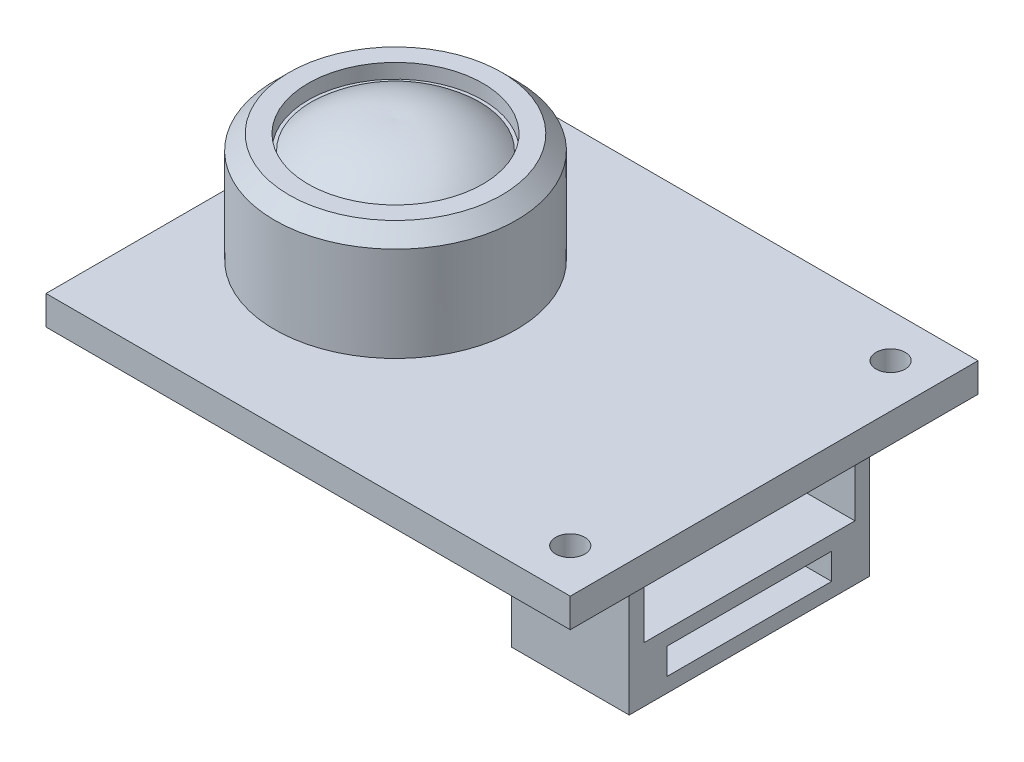
ISO-10303-21;
HEADER;
FILE_DESCRIPTION(('STEP AP214'),'2;1');
FILE_NAME('part.step','',(''),(''),'','','');
FILE_SCHEMA(('AUTOMOTIVE_DESIGN { 1 0 10303 214 1 1 1 1 }'));
ENDSEC;
DATA;
#1=APPLICATION_CONTEXT('core data for automotive mechanical design processes');
#2=APPLICATION_PROTOCOL_DEFINITION('international standard','automotive_design',2000,#1);
#3=PRODUCT_CONTEXT('',#1,'mechanical');
#4=PRODUCT('Part','Part','',(#3));
#5=PRODUCT_RELATED_PRODUCT_CATEGORY('part','',(#4));
#6=PRODUCT_DEFINITION_FORMATION('','',#4);
#7=PRODUCT_DEFINITION_CONTEXT('part definition',#1,'design');
#8=PRODUCT_DEFINITION('design','',#6,#7);
#9=PRODUCT_DEFINITION_SHAPE('','',#8);
#10=(LENGTH_UNIT() NAMED_UNIT(*) SI_UNIT(.MILLI.,.METRE.));
#11=(NAMED_UNIT(*) PLANE_ANGLE_UNIT() SI_UNIT($,.RADIAN.));
#12=(NAMED_UNIT(*) SI_UNIT($,.STERADIAN.) SOLID_ANGLE_UNIT());
#13=UNCERTAINTY_MEASURE_WITH_UNIT(LENGTH_MEASURE(1.E-05),#10,'distance_accuracy_value','');
#14=(GEOMETRIC_REPRESENTATION_CONTEXT(3) GLOBAL_UNCERTAINTY_ASSIGNED_CONTEXT((#13)) GLOBAL_UNIT_ASSIGNED_CONTEXT((#10,
#11,#12)) REPRESENTATION_CONTEXT('',''));
#15=CARTESIAN_POINT('',(0.,0.,0.));
#16=DIRECTION('',(0.,0.,1.));
#17=DIRECTION('',(1.,0.,0.));
#18=AXIS2_PLACEMENT_3D('',#15,#16,#17);
#19=CARTESIAN_POINT('',(0.,0.,0.));
#20=DIRECTION('',(0.,-1.,0.));
#21=DIRECTION('',(0.,0.,-1.));
#22=AXIS2_PLACEMENT_3D('',#19,#20,#21);
#23=PLANE('',#22);
#24=CARTESIAN_POINT('',(16.5,0.,-12.5));
#25=DIRECTION('',(0.,1.,0.));
#26=DIRECTION('',(0.,0.,1.));
#27=AXIS2_PLACEMENT_3D('',#24,#25,#26);
#28=CIRCLE('',#27,0.499999999999999);
#29=CARTESIAN_POINT('',(16.5,0.,-12.));
#30=VERTEX_POINT('',#29);
#31=EDGE_CURVE('E210',#30,#30,#28,.T.);
#32=ORIENTED_EDGE('',*,*,#31,.T.);
#33=EDGE_LOOP('',(#32));
#34=FACE_BOUND('',#33,.T.);
#35=DIRECTION('',(0.,0.,1.));
#36=VECTOR('',#35,1.);
#37=CARTESIAN_POINT('',(0.,0.,0.));
#38=LINE('',#37,#36);
#39=CARTESIAN_POINT('',(0.,0.,-14.));
#40=VERTEX_POINT('',#39);
#41=CARTESIAN_POINT('',(0.,0.,0.));
#42=VERTEX_POINT('',#41);
#43=EDGE_CURVE('E197',#40,#42,#38,.T.);
#44=ORIENTED_EDGE('',*,*,#43,.F.);
#45=DIRECTION('',(-1.,0.,0.));
#46=VECTOR('',#45,1.);
#47=CARTESIAN_POINT('',(0.,0.,-14.));
#48=LINE('',#47,#46);
#49=CARTESIAN_POINT('',(18.,0.,-14.));
#50=VERTEX_POINT('',#49);
#51=EDGE_CURVE('E217',#50,#40,#48,.T.);
#52=ORIENTED_EDGE('',*,*,#51,.F.);
#53=DIRECTION('',(0.,0.,-1.));
#54=VECTOR('',#53,1.);
#55=CARTESIAN_POINT('',(18.,0.,0.));
#56=LINE('',#55,#54);
#57=CARTESIAN_POINT('',(18.,0.,0.));
#58=VERTEX_POINT('',#57);
#59=EDGE_CURVE('E207',#58,#50,#56,.T.);
#60=ORIENTED_EDGE('',*,*,#59,.F.);
#61=DIRECTION('',(1.,0.,0.));
#62=VECTOR('',#61,1.);
#63=CARTESIAN_POINT('',(0.,0.,0.));
#64=LINE('',#63,#62);
#65=EDGE_CURVE('E204',#42,#58,#64,.T.);
#66=ORIENTED_EDGE('',*,*,#65,.F.);
#67=EDGE_LOOP('',(#44,#52,#60,#66));
#68=FACE_BOUND('',#67,.T.);
#69=CARTESIAN_POINT('',(16.5,0.,-1.5));
#70=DIRECTION('',(0.,1.,0.));
#71=DIRECTION('',(0.,0.,1.));
#72=AXIS2_PLACEMENT_3D('',#69,#70,#71);
#73=CIRCLE('',#72,0.499999999999999);
#74=CARTESIAN_POINT('',(16.5,0.,-1.));
#75=VERTEX_POINT('',#74);
#76=EDGE_CURVE('E344',#75,#75,#73,.T.);
#77=ORIENTED_EDGE('',*,*,#76,.T.);
#78=EDGE_LOOP('',(#77));
#79=FACE_BOUND('',#78,.T.);
#80=DIRECTION('',(-1.,0.,0.));
#81=VECTOR('',#80,1.);
#82=CARTESIAN_POINT('',(17.15,0.,-2.875));
#83=LINE('',#82,#81);
#84=CARTESIAN_POINT('',(17.15,0.,-2.875));
#85=VERTEX_POINT('',#84);
#86=CARTESIAN_POINT('',(13.1,0.,-2.875));
#87=VERTEX_POINT('',#86);
#88=EDGE_CURVE('E329',#85,#87,#83,.T.);
#89=ORIENTED_EDGE('',*,*,#88,.F.);
#90=DIRECTION('',(0.,0.,1.));
#91=VECTOR('',#90,1.);
#92=CARTESIAN_POINT('',(17.15,0.,-11.125));
#93=LINE('',#92,#91);
#94=CARTESIAN_POINT('',(17.15,0.,-11.125));
#95=VERTEX_POINT('',#94);
#96=EDGE_CURVE('E310',#95,#85,#93,.T.);
#97=ORIENTED_EDGE('',*,*,#96,.F.);
#98=DIRECTION('',(1.,0.,0.));
#99=VECTOR('',#98,1.);
#100=CARTESIAN_POINT('',(17.15,0.,-11.125));
#101=LINE('',#100,#99);
#102=CARTESIAN_POINT('',(13.1,0.,-11.125));
#103=VERTEX_POINT('',#102);
#104=EDGE_CURVE('E320',#103,#95,#101,.T.);
#105=ORIENTED_EDGE('',*,*,#104,.F.);
#106=DIRECTION('',(0.,0.,-1.));
#107=VECTOR('',#106,1.);
#108=CARTESIAN_POINT('',(13.1,0.,-11.125));
#109=LINE('',#108,#107);
#110=EDGE_CURVE('E331',#87,#103,#109,.T.);
#111=ORIENTED_EDGE('',*,*,#110,.F.);
#112=EDGE_LOOP('',(#89,#97,#105,#111));
#113=FACE_BOUND('',#112,.T.);
#114=ADVANCED_FACE('F38',(#34,#68,#79,#113),#23,.T.);
#115=CARTESIAN_POINT('',(0.,1.,0.));
#116=DIRECTION('',(0.,-1.,0.));
#117=DIRECTION('',(0.,0.,-1.));
#118=AXIS2_PLACEMENT_3D('',#115,#116,#117);
#119=PLANE('',#118);
#120=CARTESIAN_POINT('',(5.,1.,-7.));
#121=DIRECTION('',(0.,-1.,0.));
#122=DIRECTION('',(0.,0.,-1.));
#123=AXIS2_PLACEMENT_3D('',#120,#121,#122);
#124=CIRCLE('',#123,4.15);
#125=CARTESIAN_POINT('',(5.,1.,-11.15));
#126=VERTEX_POINT('',#125);
#127=EDGE_CURVE('E228',#126,#126,#124,.F.);
#128=ORIENTED_EDGE('',*,*,#127,.F.);
#129=EDGE_LOOP('',(#128));
#130=FACE_BOUND('',#129,.T.);
#131=DIRECTION('',(0.,0.,1.));
#132=VECTOR('',#131,1.);
#133=CARTESIAN_POINT('',(0.,1.,0.));
#134=LINE('',#133,#132);
#135=CARTESIAN_POINT('',(0.,1.,-14.));
#136=VERTEX_POINT('',#135);
#137=CARTESIAN_POINT('',(0.,1.,0.));
#138=VERTEX_POINT('',#137);
#139=EDGE_CURVE('E219',#136,#138,#134,.T.);
#140=ORIENTED_EDGE('',*,*,#139,.T.);
#141=DIRECTION('',(1.,0.,0.));
#142=VECTOR('',#141,1.);
#143=CARTESIAN_POINT('',(0.,1.,0.));
#144=LINE('',#143,#142);
#145=CARTESIAN_POINT('',(18.,1.,0.));
#146=VERTEX_POINT('',#145);
#147=EDGE_CURVE('E353',#138,#146,#144,.T.);
#148=ORIENTED_EDGE('',*,*,#147,.T.);
#149=DIRECTION('',(0.,0.,-1.));
#150=VECTOR('',#149,1.);
#151=CARTESIAN_POINT('',(18.,1.,0.));
#152=LINE('',#151,#150);
#153=CARTESIAN_POINT('',(18.,1.,-14.));
#154=VERTEX_POINT('',#153);
#155=EDGE_CURVE('E354',#146,#154,#152,.T.);
#156=ORIENTED_EDGE('',*,*,#155,.T.);
#157=DIRECTION('',(-1.,0.,0.));
#158=VECTOR('',#157,1.);
#159=CARTESIAN_POINT('',(0.,1.,-14.));
#160=LINE('',#159,#158);
#161=EDGE_CURVE('E213',#154,#136,#160,.T.);
#162=ORIENTED_EDGE('',*,*,#161,.T.);
#163=EDGE_LOOP('',(#140,#148,#156,#162));
#164=FACE_BOUND('',#163,.T.);
#165=CARTESIAN_POINT('',(16.5,1.,-12.5));
#166=DIRECTION('',(0.,1.,0.));
#167=DIRECTION('',(0.,0.,1.));
#168=AXIS2_PLACEMENT_3D('',#165,#166,#167);
#169=CIRCLE('',#168,0.499999999999999);
#170=CARTESIAN_POINT('',(16.5,1.,-12.));
#171=VERTEX_POINT('',#170);
#172=EDGE_CURVE('E205',#171,#171,#169,.T.);
#173=ORIENTED_EDGE('',*,*,#172,.F.);
#174=EDGE_LOOP('',(#173));
#175=FACE_BOUND('',#174,.T.);
#176=CARTESIAN_POINT('',(16.5,1.,-1.5));
#177=DIRECTION('',(0.,1.,0.));
#178=DIRECTION('',(0.,0.,1.));
#179=AXIS2_PLACEMENT_3D('',#176,#177,#178);
#180=CIRCLE('',#179,0.499999999999999);
#181=CARTESIAN_POINT('',(16.5,1.,-1.));
#182=VERTEX_POINT('',#181);
#183=EDGE_CURVE('E345',#182,#182,#180,.T.);
#184=ORIENTED_EDGE('',*,*,#183,.F.);
#185=EDGE_LOOP('',(#184));
#186=FACE_BOUND('',#185,.T.);
#187=ADVANCED_FACE('F164',(#130,#164,#175,#186),#119,.F.);
#188=CARTESIAN_POINT('',(0.,1.,0.));
#189=DIRECTION('',(1.,0.,0.));
#190=DIRECTION('',(0.,0.,-1.));
#191=AXIS2_PLACEMENT_3D('',#188,#189,#190);
#192=PLANE('',#191);
#193=ORIENTED_EDGE('',*,*,#43,.T.);
#194=DIRECTION('',(0.,-1.,0.));
#195=VECTOR('',#194,1.);
#196=CARTESIAN_POINT('',(0.,1.,0.));
#197=LINE('',#196,#195);
#198=EDGE_CURVE('E200',#138,#42,#197,.T.);
#199=ORIENTED_EDGE('',*,*,#198,.F.);
#200=ORIENTED_EDGE('',*,*,#139,.F.);
#201=DIRECTION('',(0.,-1.,0.));
#202=VECTOR('',#201,1.);
#203=CARTESIAN_POINT('',(0.,1.,-14.));
#204=LINE('',#203,#202);
#205=EDGE_CURVE('E202',#136,#40,#204,.T.);
#206=ORIENTED_EDGE('',*,*,#205,.T.);
#207=EDGE_LOOP('',(#193,#199,#200,#206));
#208=FACE_BOUND('',#207,.T.);
#209=ADVANCED_FACE('F170',(#208),#192,.F.);
#210=CARTESIAN_POINT('',(0.,1.,0.));
#211=DIRECTION('',(0.,0.,-1.));
#212=DIRECTION('',(-1.,0.,0.));
#213=AXIS2_PLACEMENT_3D('',#210,#211,#212);
#214=PLANE('',#213);
#215=ORIENTED_EDGE('',*,*,#65,.T.);
#216=DIRECTION('',(0.,-1.,0.));
#217=VECTOR('',#216,1.);
#218=CARTESIAN_POINT('',(18.,1.,0.));
#219=LINE('',#218,#217);
#220=EDGE_CURVE('E224',#146,#58,#219,.T.);
#221=ORIENTED_EDGE('',*,*,#220,.F.);
#222=ORIENTED_EDGE('',*,*,#147,.F.);
#223=ORIENTED_EDGE('',*,*,#198,.T.);
#224=EDGE_LOOP('',(#215,#221,#222,#223));
#225=FACE_BOUND('',#224,.T.);
#226=ADVANCED_FACE('F185',(#225),#214,.F.);
#227=CARTESIAN_POINT('',(18.,1.,0.));
#228=DIRECTION('',(-1.,0.,0.));
#229=DIRECTION('',(0.,0.,1.));
#230=AXIS2_PLACEMENT_3D('',#227,#228,#229);
#231=PLANE('',#230);
#232=ORIENTED_EDGE('',*,*,#59,.T.);
#233=DIRECTION('',(0.,-1.,0.));
#234=VECTOR('',#233,1.);
#235=CARTESIAN_POINT('',(18.,1.,-14.));
#236=LINE('',#235,#234);
#237=EDGE_CURVE('E221',#154,#50,#236,.T.);
#238=ORIENTED_EDGE('',*,*,#237,.F.);
#239=ORIENTED_EDGE('',*,*,#155,.F.);
#240=ORIENTED_EDGE('',*,*,#220,.T.);
#241=EDGE_LOOP('',(#232,#238,#239,#240));
#242=FACE_BOUND('',#241,.T.);
#243=ADVANCED_FACE('F181',(#242),#231,.F.);
#244=CARTESIAN_POINT('',(0.,1.,-14.));
#245=DIRECTION('',(0.,0.,1.));
#246=DIRECTION('',(1.,0.,0.));
#247=AXIS2_PLACEMENT_3D('',#244,#245,#246);
#248=PLANE('',#247);
#249=ORIENTED_EDGE('',*,*,#51,.T.);
#250=ORIENTED_EDGE('',*,*,#205,.F.);
#251=ORIENTED_EDGE('',*,*,#161,.F.);
#252=ORIENTED_EDGE('',*,*,#237,.T.);
#253=EDGE_LOOP('',(#249,#250,#251,#252));
#254=FACE_BOUND('',#253,.T.);
#255=ADVANCED_FACE('F177',(#254),#248,.F.);
#256=CARTESIAN_POINT('',(16.5,1.,-12.5));
#257=DIRECTION('',(0.,-1.,0.));
#258=DIRECTION('',(0.,0.,-1.));
#259=AXIS2_PLACEMENT_3D('',#256,#257,#258);
#260=CYLINDRICAL_SURFACE('',#259,0.499999999999999);
#261=ORIENTED_EDGE('',*,*,#172,.T.);
#262=EDGE_LOOP('',(#261));
#263=FACE_BOUND('',#262,.T.);
#264=ORIENTED_EDGE('',*,*,#31,.F.);
#265=EDGE_LOOP('',(#264));
#266=FACE_BOUND('',#265,.T.);
#267=ADVANCED_FACE('F180',(#263,#266),#260,.F.);
#268=CARTESIAN_POINT('',(16.5,1.,-1.5));
#269=DIRECTION('',(0.,-1.,0.));
#270=DIRECTION('',(0.,0.,-1.));
#271=AXIS2_PLACEMENT_3D('',#268,#269,#270);
#272=CYLINDRICAL_SURFACE('',#271,0.499999999999999);
#273=ORIENTED_EDGE('',*,*,#183,.T.);
#274=EDGE_LOOP('',(#273));
#275=FACE_BOUND('',#274,.T.);
#276=ORIENTED_EDGE('',*,*,#76,.F.);
#277=EDGE_LOOP('',(#276));
#278=FACE_BOUND('',#277,.T.);
#279=ADVANCED_FACE('F403',(#275,#278),#272,.F.);
#280=CARTESIAN_POINT('',(5.,4.75,-7.));
#281=DIRECTION('',(0.,-1.,0.));
#282=DIRECTION('',(0.,0.,-1.));
#283=AXIS2_PLACEMENT_3D('',#280,#281,#282);
#284=CYLINDRICAL_SURFACE('',#283,4.15);
#285=CARTESIAN_POINT('',(5.,4.25,-7.));
#286=DIRECTION('',(0.,1.,0.));
#287=DIRECTION('',(0.,0.,1.));
#288=AXIS2_PLACEMENT_3D('',#285,#286,#287);
#289=CIRCLE('',#288,4.15);
#290=CARTESIAN_POINT('',(5.,4.25,-2.85));
#291=VERTEX_POINT('',#290);
#292=EDGE_CURVE('E46',#291,#291,#289,.F.);
#293=ORIENTED_EDGE('',*,*,#292,.T.);
#294=EDGE_LOOP('',(#293));
#295=FACE_BOUND('',#294,.T.);
#296=ORIENTED_EDGE('',*,*,#127,.T.);
#297=EDGE_LOOP('',(#296));
#298=FACE_BOUND('',#297,.T.);
#299=ADVANCED_FACE('F236',(#295,#298),#284,.T.);
#300=CARTESIAN_POINT('',(5.,4.75,-7.));
#301=DIRECTION('',(0.,1.,0.));
#302=DIRECTION('',(0.,0.,1.));
#303=AXIS2_PLACEMENT_3D('',#300,#301,#302);
#304=PLANE('',#303);
#305=CARTESIAN_POINT('',(5.,4.75,-7.));
#306=DIRECTION('',(0.,1.,0.));
#307=DIRECTION('',(0.,0.,1.));
#308=AXIS2_PLACEMENT_3D('',#305,#306,#307);
#309=CIRCLE('',#308,3.65);
#310=CARTESIAN_POINT('',(5.,4.75,-3.35));
#311=VERTEX_POINT('',#310);
#312=EDGE_CURVE('E231',#311,#311,#309,.T.);
#313=ORIENTED_EDGE('',*,*,#312,.T.);
#314=EDGE_LOOP('',(#313));
#315=FACE_BOUND('',#314,.T.);
#316=CARTESIAN_POINT('',(5.,4.75,-7.));
#317=DIRECTION('',(0.,1.,0.));
#318=DIRECTION('',(0.,0.,1.));
#319=AXIS2_PLACEMENT_3D('',#316,#317,#318);
#320=CIRCLE('',#319,3.);
#321=CARTESIAN_POINT('',(5.,4.75,-4.));
#322=VERTEX_POINT('',#321);
#323=EDGE_CURVE('E248',#322,#322,#320,.T.);
#324=ORIENTED_EDGE('',*,*,#323,.F.);
#325=EDGE_LOOP('',(#324));
#326=FACE_BOUND('',#325,.T.);
#327=ADVANCED_FACE('F241',(#315,#326),#304,.T.);
#328=CARTESIAN_POINT('',(17.15,-4.4,-11.125));
#329=DIRECTION('',(-1.,0.,0.));
#330=DIRECTION('',(0.,0.,1.));
#331=AXIS2_PLACEMENT_3D('',#328,#329,#330);
#332=PLANE('',#331);
#333=DIRECTION('',(0.,0.,-1.));
#334=VECTOR('',#333,1.);
#335=CARTESIAN_POINT('',(17.15,-3.9,-4.175));
#336=LINE('',#335,#334);
#337=CARTESIAN_POINT('',(17.15,-3.9,-4.175));
#338=VERTEX_POINT('',#337);
#339=CARTESIAN_POINT('',(17.15,-3.9,-9.825));
#340=VERTEX_POINT('',#339);
#341=EDGE_CURVE('E270',#338,#340,#336,.T.);
#342=ORIENTED_EDGE('',*,*,#341,.F.);
#343=DIRECTION('',(0.,-1.,0.));
#344=VECTOR('',#343,1.);
#345=CARTESIAN_POINT('',(17.15,-3.,-4.175));
#346=LINE('',#345,#344);
#347=CARTESIAN_POINT('',(17.15,-3.,-4.175));
#348=VERTEX_POINT('',#347);
#349=EDGE_CURVE('E53',#348,#338,#346,.T.);
#350=ORIENTED_EDGE('',*,*,#349,.F.);
#351=DIRECTION('',(0.,0.,1.));
#352=VECTOR('',#351,1.);
#353=CARTESIAN_POINT('',(17.15,-3.,-4.175));
#354=LINE('',#353,#352);
#355=CARTESIAN_POINT('',(17.15,-3.,-9.825));
#356=VERTEX_POINT('',#355);
#357=EDGE_CURVE('E259',#356,#348,#354,.T.);
#358=ORIENTED_EDGE('',*,*,#357,.F.);
#359=DIRECTION('',(0.,1.,0.));
#360=VECTOR('',#359,1.);
#361=CARTESIAN_POINT('',(17.15,-3.,-9.825));
#362=LINE('',#361,#360);
#363=EDGE_CURVE('E273',#340,#356,#362,.T.);
#364=ORIENTED_EDGE('',*,*,#363,.F.);
#365=EDGE_LOOP('',(#342,#350,#358,#364));
#366=FACE_BOUND('',#365,.T.);
#367=DIRECTION('',(0.,0.,-1.));
#368=VECTOR('',#367,1.);
#369=CARTESIAN_POINT('',(17.15,-2.5,-3.375));
#370=LINE('',#369,#368);
#371=CARTESIAN_POINT('',(17.15,-2.5,-3.375));
#372=VERTEX_POINT('',#371);
#373=CARTESIAN_POINT('',(17.15,-2.5,-10.625));
#374=VERTEX_POINT('',#373);
#375=EDGE_CURVE('E300',#372,#374,#370,.T.);
#376=ORIENTED_EDGE('',*,*,#375,.F.);
#377=DIRECTION('',(0.,-1.,0.));
#378=VECTOR('',#377,1.);
#379=CARTESIAN_POINT('',(17.15,-0.5,-3.375));
#380=LINE('',#379,#378);
#381=CARTESIAN_POINT('',(17.15,-0.5,-3.375));
#382=VERTEX_POINT('',#381);
#383=EDGE_CURVE('E61',#382,#372,#380,.T.);
#384=ORIENTED_EDGE('',*,*,#383,.F.);
#385=DIRECTION('',(0.,0.,1.));
#386=VECTOR('',#385,1.);
#387=CARTESIAN_POINT('',(17.15,-0.5,-3.375));
#388=LINE('',#387,#386);
#389=CARTESIAN_POINT('',(17.15,-0.5,-10.625));
#390=VERTEX_POINT('',#389);
#391=EDGE_CURVE('E289',#390,#382,#388,.T.);
#392=ORIENTED_EDGE('',*,*,#391,.F.);
#393=DIRECTION('',(0.,1.,0.));
#394=VECTOR('',#393,1.);
#395=CARTESIAN_POINT('',(17.15,-0.5,-10.625));
#396=LINE('',#395,#394);
#397=EDGE_CURVE('E303',#374,#390,#396,.T.);
#398=ORIENTED_EDGE('',*,*,#397,.F.);
#399=EDGE_LOOP('',(#376,#384,#392,#398));
#400=FACE_BOUND('',#399,.T.);
#401=ORIENTED_EDGE('',*,*,#96,.T.);
#402=DIRECTION('',(0.,1.,0.));
#403=VECTOR('',#402,1.);
#404=CARTESIAN_POINT('',(17.15,-4.4,-2.875));
#405=LINE('',#404,#403);
#406=CARTESIAN_POINT('',(17.15,-4.4,-2.875));
#407=VERTEX_POINT('',#406);
#408=EDGE_CURVE('E342',#407,#85,#405,.T.);
#409=ORIENTED_EDGE('',*,*,#408,.F.);
#410=DIRECTION('',(0.,0.,1.));
#411=VECTOR('',#410,1.);
#412=CARTESIAN_POINT('',(17.15,-4.4,-11.125));
#413=LINE('',#412,#411);
#414=CARTESIAN_POINT('',(17.15,-4.4,-11.125));
#415=VERTEX_POINT('',#414);
#416=EDGE_CURVE('E316',#415,#407,#413,.T.);
#417=ORIENTED_EDGE('',*,*,#416,.F.);
#418=DIRECTION('',(0.,1.,0.));
#419=VECTOR('',#418,1.);
#420=CARTESIAN_POINT('',(17.15,-4.4,-11.125));
#421=LINE('',#420,#419);
#422=EDGE_CURVE('E326',#415,#95,#421,.T.);
#423=ORIENTED_EDGE('',*,*,#422,.T.);
#424=EDGE_LOOP('',(#401,#409,#417,#423));
#425=FACE_BOUND('',#424,.T.);
#426=ADVANCED_FACE('F244',(#366,#400,#425),#332,.F.);
#427=CARTESIAN_POINT('',(17.15,-4.4,-2.875));
#428=DIRECTION('',(0.,0.,-1.));
#429=DIRECTION('',(-1.,0.,0.));
#430=AXIS2_PLACEMENT_3D('',#427,#428,#429);
#431=PLANE('',#430);
#432=ORIENTED_EDGE('',*,*,#88,.T.);
#433=DIRECTION('',(0.,1.,0.));
#434=VECTOR('',#433,1.);
#435=CARTESIAN_POINT('',(13.1,-4.4,-2.875));
#436=LINE('',#435,#434);
#437=CARTESIAN_POINT('',(13.1,-4.4,-2.875));
#438=VERTEX_POINT('',#437);
#439=EDGE_CURVE('E339',#438,#87,#436,.T.);
#440=ORIENTED_EDGE('',*,*,#439,.F.);
#441=DIRECTION('',(-1.,0.,0.));
#442=VECTOR('',#441,1.);
#443=CARTESIAN_POINT('',(17.15,-4.4,-2.875));
#444=LINE('',#443,#442);
#445=EDGE_CURVE('E319',#407,#438,#444,.T.);
#446=ORIENTED_EDGE('',*,*,#445,.F.);
#447=ORIENTED_EDGE('',*,*,#408,.T.);
#448=EDGE_LOOP('',(#432,#440,#446,#447));
#449=FACE_BOUND('',#448,.T.);
#450=ADVANCED_FACE('F371',(#449),#431,.F.);
#451=CARTESIAN_POINT('',(13.1,-4.4,-11.125));
#452=DIRECTION('',(1.,0.,0.));
#453=DIRECTION('',(0.,0.,-1.));
#454=AXIS2_PLACEMENT_3D('',#451,#452,#453);
#455=PLANE('',#454);
#456=ORIENTED_EDGE('',*,*,#110,.T.);
#457=DIRECTION('',(0.,1.,0.));
#458=VECTOR('',#457,1.);
#459=CARTESIAN_POINT('',(13.1,-4.4,-11.125));
#460=LINE('',#459,#458);
#461=CARTESIAN_POINT('',(13.1,-4.4,-11.125));
#462=VERTEX_POINT('',#461);
#463=EDGE_CURVE('E337',#462,#103,#460,.T.);
#464=ORIENTED_EDGE('',*,*,#463,.F.);
#465=DIRECTION('',(0.,0.,-1.));
#466=VECTOR('',#465,1.);
#467=CARTESIAN_POINT('',(13.1,-4.4,-11.125));
#468=LINE('',#467,#466);
#469=EDGE_CURVE('E322',#438,#462,#468,.T.);
#470=ORIENTED_EDGE('',*,*,#469,.F.);
#471=ORIENTED_EDGE('',*,*,#439,.T.);
#472=EDGE_LOOP('',(#456,#464,#470,#471));
#473=FACE_BOUND('',#472,.T.);
#474=ADVANCED_FACE('F375',(#473),#455,.F.);
#475=CARTESIAN_POINT('',(17.15,-4.4,-11.125));
#476=DIRECTION('',(0.,0.,1.));
#477=DIRECTION('',(1.,0.,0.));
#478=AXIS2_PLACEMENT_3D('',#475,#476,#477);
#479=PLANE('',#478);
#480=ORIENTED_EDGE('',*,*,#104,.T.);
#481=ORIENTED_EDGE('',*,*,#422,.F.);
#482=DIRECTION('',(1.,0.,0.));
#483=VECTOR('',#482,1.);
#484=CARTESIAN_POINT('',(17.15,-4.4,-11.125));
#485=LINE('',#484,#483);
#486=EDGE_CURVE('E324',#462,#415,#485,.T.);
#487=ORIENTED_EDGE('',*,*,#486,.F.);
#488=ORIENTED_EDGE('',*,*,#463,.T.);
#489=EDGE_LOOP('',(#480,#481,#487,#488));
#490=FACE_BOUND('',#489,.T.);
#491=ADVANCED_FACE('F384',(#490),#479,.F.);
#492=CARTESIAN_POINT('',(0.,-4.4,0.));
#493=DIRECTION('',(0.,-1.,0.));
#494=DIRECTION('',(0.,0.,-1.));
#495=AXIS2_PLACEMENT_3D('',#492,#493,#494);
#496=PLANE('',#495);
#497=ORIENTED_EDGE('',*,*,#416,.T.);
#498=ORIENTED_EDGE('',*,*,#445,.T.);
#499=ORIENTED_EDGE('',*,*,#469,.T.);
#500=ORIENTED_EDGE('',*,*,#486,.T.);
#501=EDGE_LOOP('',(#497,#498,#499,#500));
#502=FACE_BOUND('',#501,.T.);
#503=ADVANCED_FACE('F379',(#502),#496,.T.);
#504=CARTESIAN_POINT('',(14.15,-0.5,-3.375));
#505=DIRECTION('',(0.,0.,1.));
#506=DIRECTION('',(0.,-1.,0.));
#507=AXIS2_PLACEMENT_3D('',#504,#505,#506);
#508=PLANE('',#507);
#509=ORIENTED_EDGE('',*,*,#383,.T.);
#510=DIRECTION('',(1.,0.,0.));
#511=VECTOR('',#510,1.);
#512=CARTESIAN_POINT('',(14.15,-2.5,-3.375));
#513=LINE('',#512,#511);
#514=CARTESIAN_POINT('',(14.15,-2.5,-3.375));
#515=VERTEX_POINT('',#514);
#516=EDGE_CURVE('E298',#515,#372,#513,.T.);
#517=ORIENTED_EDGE('',*,*,#516,.F.);
#518=DIRECTION('',(0.,-1.,0.));
#519=VECTOR('',#518,1.);
#520=CARTESIAN_POINT('',(14.15,-0.5,-3.375));
#521=LINE('',#520,#519);
#522=CARTESIAN_POINT('',(14.15,-0.5,-3.375));
#523=VERTEX_POINT('',#522);
#524=EDGE_CURVE('E285',#523,#515,#521,.T.);
#525=ORIENTED_EDGE('',*,*,#524,.F.);
#526=DIRECTION('',(1.,0.,0.));
#527=VECTOR('',#526,1.);
#528=CARTESIAN_POINT('',(14.15,-0.5,-3.375));
#529=LINE('',#528,#527);
#530=EDGE_CURVE('E308',#523,#382,#529,.T.);
#531=ORIENTED_EDGE('',*,*,#530,.T.);
#532=EDGE_LOOP('',(#509,#517,#525,#531));
#533=FACE_BOUND('',#532,.T.);
#534=ADVANCED_FACE('F391',(#533),#508,.F.);
#535=CARTESIAN_POINT('',(14.15,-0.5,-3.375));
#536=DIRECTION('',(0.,1.,0.));
#537=DIRECTION('',(0.,0.,1.));
#538=AXIS2_PLACEMENT_3D('',#535,#536,#537);
#539=PLANE('',#538);
#540=ORIENTED_EDGE('',*,*,#391,.T.);
#541=ORIENTED_EDGE('',*,*,#530,.F.);
#542=DIRECTION('',(0.,0.,1.));
#543=VECTOR('',#542,1.);
#544=CARTESIAN_POINT('',(14.15,-0.5,-3.375));
#545=LINE('',#544,#543);
#546=CARTESIAN_POINT('',(14.15,-0.5,-10.625));
#547=VERTEX_POINT('',#546);
#548=EDGE_CURVE('E295',#547,#523,#545,.T.);
#549=ORIENTED_EDGE('',*,*,#548,.F.);
#550=DIRECTION('',(1.,0.,0.));
#551=VECTOR('',#550,1.);
#552=CARTESIAN_POINT('',(14.15,-0.5,-10.625));
#553=LINE('',#552,#551);
#554=EDGE_CURVE('E311',#547,#390,#553,.T.);
#555=ORIENTED_EDGE('',*,*,#554,.T.);
#556=EDGE_LOOP('',(#540,#541,#549,#555));
#557=FACE_BOUND('',#556,.T.);
#558=ADVANCED_FACE('F464',(#557),#539,.F.);
#559=CARTESIAN_POINT('',(14.15,-0.5,-10.625));
#560=DIRECTION('',(0.,0.,-1.));
#561=DIRECTION('',(-1.,0.,0.));
#562=AXIS2_PLACEMENT_3D('',#559,#560,#561);
#563=PLANE('',#562);
#564=ORIENTED_EDGE('',*,*,#397,.T.);
#565=ORIENTED_EDGE('',*,*,#554,.F.);
#566=DIRECTION('',(0.,1.,0.));
#567=VECTOR('',#566,1.);
#568=CARTESIAN_POINT('',(14.15,-0.5,-10.625));
#569=LINE('',#568,#567);
#570=CARTESIAN_POINT('',(14.15,-2.5,-10.625));
#571=VERTEX_POINT('',#570);
#572=EDGE_CURVE('E292',#571,#547,#569,.T.);
#573=ORIENTED_EDGE('',*,*,#572,.F.);
#574=DIRECTION('',(1.,0.,0.));
#575=VECTOR('',#574,1.);
#576=CARTESIAN_POINT('',(14.15,-2.5,-10.625));
#577=LINE('',#576,#575);
#578=EDGE_CURVE('E313',#571,#374,#577,.T.);
#579=ORIENTED_EDGE('',*,*,#578,.T.);
#580=EDGE_LOOP('',(#564,#565,#573,#579));
#581=FACE_BOUND('',#580,.T.);
#582=ADVANCED_FACE('F469',(#581),#563,.F.);
#583=CARTESIAN_POINT('',(14.15,-2.5,-3.375));
#584=DIRECTION('',(0.,-1.,0.));
#585=DIRECTION('',(0.,0.,-1.));
#586=AXIS2_PLACEMENT_3D('',#583,#584,#585);
#587=PLANE('',#586);
#588=ORIENTED_EDGE('',*,*,#375,.T.);
#589=ORIENTED_EDGE('',*,*,#578,.F.);
#590=DIRECTION('',(0.,0.,-1.));
#591=VECTOR('',#590,1.);
#592=CARTESIAN_POINT('',(14.15,-2.5,-3.375));
#593=LINE('',#592,#591);
#594=EDGE_CURVE('E288',#515,#571,#593,.T.);
#595=ORIENTED_EDGE('',*,*,#594,.F.);
#596=ORIENTED_EDGE('',*,*,#516,.T.);
#597=EDGE_LOOP('',(#588,#589,#595,#596));
#598=FACE_BOUND('',#597,.T.);
#599=ADVANCED_FACE('F477',(#598),#587,.F.);
#600=CARTESIAN_POINT('',(14.15,0.,0.));
#601=DIRECTION('',(1.,0.,0.));
#602=DIRECTION('',(0.,0.,-1.));
#603=AXIS2_PLACEMENT_3D('',#600,#601,#602);
#604=PLANE('',#603);
#605=ORIENTED_EDGE('',*,*,#524,.T.);
#606=ORIENTED_EDGE('',*,*,#594,.T.);
#607=ORIENTED_EDGE('',*,*,#572,.T.);
#608=ORIENTED_EDGE('',*,*,#548,.T.);
#609=EDGE_LOOP('',(#605,#606,#607,#608));
#610=FACE_BOUND('',#609,.T.);
#611=ADVANCED_FACE('F485',(#610),#604,.T.);
#612=CARTESIAN_POINT('',(14.15,-3.,-4.175));
#613=DIRECTION('',(0.,0.,1.));
#614=DIRECTION('',(1.,0.,0.));
#615=AXIS2_PLACEMENT_3D('',#612,#613,#614);
#616=PLANE('',#615);
#617=ORIENTED_EDGE('',*,*,#349,.T.);
#618=DIRECTION('',(1.,0.,0.));
#619=VECTOR('',#618,1.);
#620=CARTESIAN_POINT('',(14.15,-3.9,-4.175));
#621=LINE('',#620,#619);
#622=CARTESIAN_POINT('',(14.15,-3.9,-4.175));
#623=VERTEX_POINT('',#622);
#624=EDGE_CURVE('E268',#623,#338,#621,.T.);
#625=ORIENTED_EDGE('',*,*,#624,.F.);
#626=DIRECTION('',(0.,-1.,0.));
#627=VECTOR('',#626,1.);
#628=CARTESIAN_POINT('',(14.15,-3.,-4.175));
#629=LINE('',#628,#627);
#630=CARTESIAN_POINT('',(14.15,-3.,-4.175));
#631=VERTEX_POINT('',#630);
#632=EDGE_CURVE('E255',#631,#623,#629,.T.);
#633=ORIENTED_EDGE('',*,*,#632,.F.);
#634=DIRECTION('',(1.,0.,0.));
#635=VECTOR('',#634,1.);
#636=CARTESIAN_POINT('',(14.15,-3.,-4.175));
#637=LINE('',#636,#635);
#638=EDGE_CURVE('E278',#631,#348,#637,.T.);
#639=ORIENTED_EDGE('',*,*,#638,.T.);
#640=EDGE_LOOP('',(#617,#625,#633,#639));
#641=FACE_BOUND('',#640,.T.);
#642=ADVANCED_FACE('F493',(#641),#616,.F.);
#643=CARTESIAN_POINT('',(14.15,-3.,-4.175));
#644=DIRECTION('',(0.,1.,0.));
#645=DIRECTION('',(0.,0.,1.));
#646=AXIS2_PLACEMENT_3D('',#643,#644,#645);
#647=PLANE('',#646);
#648=ORIENTED_EDGE('',*,*,#357,.T.);
#649=ORIENTED_EDGE('',*,*,#638,.F.);
#650=DIRECTION('',(0.,0.,1.));
#651=VECTOR('',#650,1.);
#652=CARTESIAN_POINT('',(14.15,-3.,-4.175));
#653=LINE('',#652,#651);
#654=CARTESIAN_POINT('',(14.15,-3.,-9.825));
#655=VERTEX_POINT('',#654);
#656=EDGE_CURVE('E265',#655,#631,#653,.T.);
#657=ORIENTED_EDGE('',*,*,#656,.F.);
#658=DIRECTION('',(1.,0.,0.));
#659=VECTOR('',#658,1.);
#660=CARTESIAN_POINT('',(14.15,-3.,-9.825));
#661=LINE('',#660,#659);
#662=EDGE_CURVE('E280',#655,#356,#661,.T.);
#663=ORIENTED_EDGE('',*,*,#662,.T.);
#664=EDGE_LOOP('',(#648,#649,#657,#663));
#665=FACE_BOUND('',#664,.T.);
#666=ADVANCED_FACE('F501',(#665),#647,.F.);
#667=CARTESIAN_POINT('',(14.15,-3.,-9.825));
#668=DIRECTION('',(0.,0.,-1.));
#669=DIRECTION('',(-1.,0.,0.));
#670=AXIS2_PLACEMENT_3D('',#667,#668,#669);
#671=PLANE('',#670);
#672=ORIENTED_EDGE('',*,*,#363,.T.);
#673=ORIENTED_EDGE('',*,*,#662,.F.);
#674=DIRECTION('',(0.,1.,0.));
#675=VECTOR('',#674,1.);
#676=CARTESIAN_POINT('',(14.15,-3.,-9.825));
#677=LINE('',#676,#675);
#678=CARTESIAN_POINT('',(14.15,-3.9,-9.825));
#679=VERTEX_POINT('',#678);
#680=EDGE_CURVE('E262',#679,#655,#677,.T.);
#681=ORIENTED_EDGE('',*,*,#680,.F.);
#682=DIRECTION('',(1.,0.,0.));
#683=VECTOR('',#682,1.);
#684=CARTESIAN_POINT('',(14.15,-3.9,-9.825));
#685=LINE('',#684,#683);
#686=EDGE_CURVE('E282',#679,#340,#685,.T.);
#687=ORIENTED_EDGE('',*,*,#686,.T.);
#688=EDGE_LOOP('',(#672,#673,#681,#687));
#689=FACE_BOUND('',#688,.T.);
#690=ADVANCED_FACE('F508',(#689),#671,.F.);
#691=CARTESIAN_POINT('',(14.15,-3.9,-4.175));
#692=DIRECTION('',(0.,-1.,0.));
#693=DIRECTION('',(0.,0.,-1.));
#694=AXIS2_PLACEMENT_3D('',#691,#692,#693);
#695=PLANE('',#694);
#696=ORIENTED_EDGE('',*,*,#341,.T.);
#697=ORIENTED_EDGE('',*,*,#686,.F.);
#698=DIRECTION('',(0.,0.,-1.));
#699=VECTOR('',#698,1.);
#700=CARTESIAN_POINT('',(14.15,-3.9,-4.175));
#701=LINE('',#700,#699);
#702=EDGE_CURVE('E258',#623,#679,#701,.T.);
#703=ORIENTED_EDGE('',*,*,#702,.F.);
#704=ORIENTED_EDGE('',*,*,#624,.T.);
#705=EDGE_LOOP('',(#696,#697,#703,#704));
#706=FACE_BOUND('',#705,.T.);
#707=ADVANCED_FACE('F516',(#706),#695,.F.);
#708=CARTESIAN_POINT('',(14.15,0.,0.));
#709=DIRECTION('',(1.,0.,0.));
#710=DIRECTION('',(0.,0.,-1.));
#711=AXIS2_PLACEMENT_3D('',#708,#709,#710);
#712=PLANE('',#711);
#713=ORIENTED_EDGE('',*,*,#632,.T.);
#714=ORIENTED_EDGE('',*,*,#702,.T.);
#715=ORIENTED_EDGE('',*,*,#680,.T.);
#716=ORIENTED_EDGE('',*,*,#656,.T.);
#717=EDGE_LOOP('',(#713,#714,#715,#716));
#718=FACE_BOUND('',#717,.T.);
#719=ADVANCED_FACE('F524',(#718),#712,.T.);
#720=CARTESIAN_POINT('',(5.,4.25,-7.));
#721=DIRECTION('',(0.,1.,0.));
#722=DIRECTION('',(0.,0.,1.));
#723=AXIS2_PLACEMENT_3D('',#720,#721,#722);
#724=CYLINDRICAL_SURFACE('',#723,3.);
#725=CARTESIAN_POINT('',(5.,4.25,-7.));
#726=DIRECTION('',(0.,1.,0.));
#727=DIRECTION('',(0.,0.,1.));
#728=AXIS2_PLACEMENT_3D('',#725,#726,#727);
#729=CIRCLE('',#728,3.);
#730=CARTESIAN_POINT('',(5.,4.25,-4.));
#731=VERTEX_POINT('',#730);
#732=EDGE_CURVE('E250',#731,#731,#729,.T.);
#733=ORIENTED_EDGE('',*,*,#732,.F.);
#734=EDGE_LOOP('',(#733));
#735=FACE_BOUND('',#734,.T.);
#736=ORIENTED_EDGE('',*,*,#323,.T.);
#737=EDGE_LOOP('',(#736));
#738=FACE_BOUND('',#737,.T.);
#739=ADVANCED_FACE('F532',(#735,#738),#724,.F.);
#740=CARTESIAN_POINT('',(5.,4.25,-7.));
#741=DIRECTION('',(0.,1.,0.));
#742=DIRECTION('',(0.,0.,1.));
#743=AXIS2_PLACEMENT_3D('',#740,#741,#742);
#744=PLANE('',#743);
#745=CARTESIAN_POINT('',(4.99847421906452,4.25,-7.));
#746=DIRECTION('',(0.,-1.,0.));
#747=DIRECTION('',(0.,0.,-1.));
#748=AXIS2_PLACEMENT_3D('',#745,#746,#747);
#749=CIRCLE('',#748,2.88820272596063);
#750=CARTESIAN_POINT('',(4.99847421906452,4.25,-9.88820272596063));
#751=VERTEX_POINT('',#750);
#752=EDGE_CURVE('E11',#751,#751,#749,.F.);
#753=ORIENTED_EDGE('',*,*,#752,.F.);
#754=EDGE_LOOP('',(#753));
#755=FACE_BOUND('',#754,.T.);
#756=ORIENTED_EDGE('',*,*,#732,.T.);
#757=EDGE_LOOP('',(#756));
#758=FACE_BOUND('',#757,.T.);
#759=ADVANCED_FACE('F159',(#755,#758),#744,.T.);
#760=CARTESIAN_POINT('',(5.,4.75,-7.));
#761=DIRECTION('',(0.,-1.,0.));
#762=DIRECTION('',(0.,0.,-1.));
#763=AXIS2_PLACEMENT_3D('',#760,#761,#762);
#764=CONICAL_SURFACE('',#763,3.65,0.785398163397449);
#765=ORIENTED_EDGE('',*,*,#292,.F.);
#766=EDGE_LOOP('',(#765));
#767=FACE_BOUND('',#766,.T.);
#768=ORIENTED_EDGE('',*,*,#312,.F.);
#769=EDGE_LOOP('',(#768));
#770=FACE_BOUND('',#769,.T.);
#771=ADVANCED_FACE('F40',(#767,#770),#764,.T.);
#772=CARTESIAN_POINT('',(2.09033502275702,4.23282599086861,-7.));
#773=CARTESIAN_POINT('',(3.35084440759186,5.32475946298672,-7.));
#774=CARTESIAN_POINT('',(4.99847421906452,5.20955341227136,-7.));
#775=B_SPLINE_CURVE_WITH_KNOTS('',2,(#772,#773,#774),.UNSPECIFIED.,.F.,.F.,(3,3),(0.,1.),.UNSPECIFIED.);
#776=CARTESIAN_POINT('',(4.99847421906452,4.23282599086861,-7.));
#777=DIRECTION('',(0.,-1.,0.));
#778=AXIS1_PLACEMENT('',#776,#777);
#779=SURFACE_OF_REVOLUTION('',#775,#778);
#780=ORIENTED_EDGE('',*,*,#752,.T.);
#781=EDGE_LOOP('',(#780));
#782=FACE_BOUND('',#781,.T.);
#783=CARTESIAN_POINT('',(4.99847421906452,5.20955341227136,-7.));
#784=VERTEX_POINT('',#783);
#785=VERTEX_LOOP('',#784);
#786=FACE_BOUND('',#785,.T.);
#787=ADVANCED_FACE('F152',(#782,#786),#779,.F.);
#788=CLOSED_SHELL('',(#114,#187,#209,#226,#243,#255,#267,#279,#299,#327,#426,#450,#474,#491,
#503,#534,#558,#582,#599,#611,#642,#666,#690,#707,#719,#739,#759,#771,#787));
#789=MANIFOLD_SOLID_BREP('B2',#788);
#790=ADVANCED_BREP_SHAPE_REPRESENTATION('',(#18,#789),#14);
#791=SHAPE_DEFINITION_REPRESENTATION(#9,#790);
ENDSEC;
END-ISO-10303-21;
